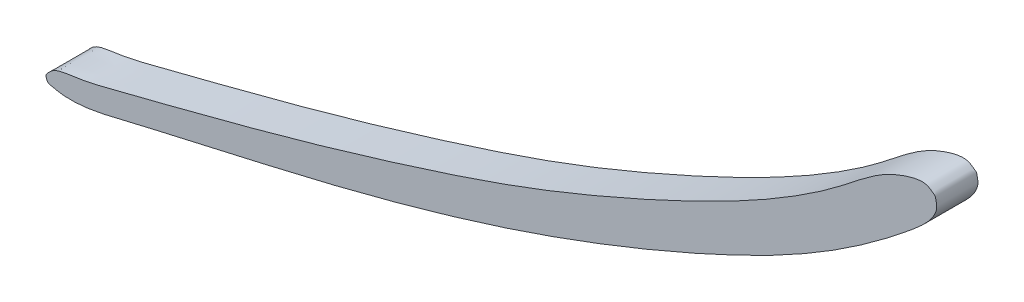
ISO-10303-21;
HEADER;
FILE_DESCRIPTION(('STEP AP214'),'2;1');
FILE_NAME('part.step','',(''),(''),'','','');
FILE_SCHEMA(('AUTOMOTIVE_DESIGN { 1 0 10303 214 1 1 1 1 }'));
ENDSEC;
DATA;
#1=APPLICATION_CONTEXT('core data for automotive mechanical design processes');
#2=APPLICATION_PROTOCOL_DEFINITION('international standard','automotive_design',2000,#1);
#3=PRODUCT_CONTEXT('',#1,'mechanical');
#4=PRODUCT('Part','Part','',(#3));
#5=PRODUCT_RELATED_PRODUCT_CATEGORY('part','',(#4));
#6=PRODUCT_DEFINITION_FORMATION('','',#4);
#7=PRODUCT_DEFINITION_CONTEXT('part definition',#1,'design');
#8=PRODUCT_DEFINITION('design','',#6,#7);
#9=PRODUCT_DEFINITION_SHAPE('','',#8);
#10=(LENGTH_UNIT() NAMED_UNIT(*) SI_UNIT(.MILLI.,.METRE.));
#11=(NAMED_UNIT(*) PLANE_ANGLE_UNIT() SI_UNIT($,.RADIAN.));
#12=(NAMED_UNIT(*) SI_UNIT($,.STERADIAN.) SOLID_ANGLE_UNIT());
#13=UNCERTAINTY_MEASURE_WITH_UNIT(LENGTH_MEASURE(1.E-05),#10,'distance_accuracy_value','');
#14=(GEOMETRIC_REPRESENTATION_CONTEXT(3) GLOBAL_UNCERTAINTY_ASSIGNED_CONTEXT((#13)) GLOBAL_UNIT_ASSIGNED_CONTEXT((#10,
#11,#12)) REPRESENTATION_CONTEXT('',''));
#15=CARTESIAN_POINT('',(0.,0.,0.));
#16=DIRECTION('',(0.,0.,1.));
#17=DIRECTION('',(1.,0.,0.));
#18=AXIS2_PLACEMENT_3D('',#15,#16,#17);
#19=CARTESIAN_POINT('',(96.7903541302584,0.,220.));
#20=CARTESIAN_POINT('',(96.7305949884533,0.112892948542311,220.));
#21=CARTESIAN_POINT('',(96.6335739233476,0.195894624406671,220.));
#22=CARTESIAN_POINT('',(96.4342964633792,0.350080639797622,220.));
#23=CARTESIAN_POINT('',(96.3300652888934,0.420822365926357,220.));
#24=CARTESIAN_POINT('',(96.1250730963667,0.567104992273969,220.));
#25=CARTESIAN_POINT('',(96.0237147495585,0.641819795805425,220.));
#26=CARTESIAN_POINT('',(95.8152024217018,0.783234128017668,220.));
#27=CARTESIAN_POINT('',(95.7084806584695,0.850125334737159,220.));
#28=CARTESIAN_POINT('',(95.4902173944732,0.972091570993068,220.));
#29=CARTESIAN_POINT('',(95.3782640803127,1.0269045485909,220.));
#30=CARTESIAN_POINT('',(95.1443501819487,1.11464771935873,220.));
#31=CARTESIAN_POINT('',(95.0216533627998,1.14855780403344,220.));
#32=CARTESIAN_POINT('',(94.6496729130398,1.22210791907423,220.));
#33=CARTESIAN_POINT('',(94.399857601767,1.23442321865137,220.));
#34=CARTESIAN_POINT('',(93.8984500700987,1.22336867425964,220.));
#35=CARTESIAN_POINT('',(93.6464849682332,1.19877095873407,220.));
#36=CARTESIAN_POINT('',(93.150528305117,1.13178790698281,220.));
#37=CARTESIAN_POINT('',(92.9050921176389,1.08835780062041,220.));
#38=CARTESIAN_POINT('',(92.1754579965681,0.931973573945645,220.));
#39=CARTESIAN_POINT('',(91.6972767066622,0.795497223712419,220.));
#40=CARTESIAN_POINT('',(90.7486323088257,0.492370083732729,220.));
#41=CARTESIAN_POINT('',(90.2774444039887,0.322798805678414,220.));
#42=CARTESIAN_POINT('',(89.3499836492739,-0.0445400427746258,220.));
#43=CARTESIAN_POINT('',(88.8941405452652,-0.241484182649347,220.));
#44=CARTESIAN_POINT('',(87.549021489601,-0.870034298573729,220.));
#45=CARTESIAN_POINT('',(86.6829413170053,-1.34068004890797,220.));
#46=CARTESIAN_POINT('',(84.1716747423128,-2.89899923855201,220.));
#47=CARTESIAN_POINT('',(82.6048693072889,-4.11865354855934,220.));
#48=CARTESIAN_POINT('',(80.2646734764845,-5.96473663269701,220.));
#49=CARTESIAN_POINT('',(79.4850022871872,-6.58075619639476,220.));
#50=CARTESIAN_POINT('',(77.9137187696427,-7.79284121974327,220.));
#51=CARTESIAN_POINT('',(77.1228172796095,-8.39009451748421,220.));
#52=CARTESIAN_POINT('',(74.7234336569646,-10.1372725171358,220.));
#53=CARTESIAN_POINT('',(73.0903647129714,-11.2461117083136,220.));
#54=CARTESIAN_POINT('',(69.7809185094782,-13.3914202239965,220.));
#55=CARTESIAN_POINT('',(68.1044480083285,-14.4277337381064,220.));
#56=CARTESIAN_POINT('',(64.7187535655036,-16.4456285031068,220.));
#57=CARTESIAN_POINT('',(63.008405337399,-17.4253310279825,220.));
#58=CARTESIAN_POINT('',(59.5542014872504,-19.3287439292616,220.));
#59=CARTESIAN_POINT('',(57.8108861270878,-20.2533571041198,220.));
#60=CARTESIAN_POINT('',(52.5429094648941,-22.9636460588946,220.));
#61=CARTESIAN_POINT('',(48.9816559518119,-24.6901926765844,220.));
#62=CARTESIAN_POINT('',(41.8031741600348,-28.0410891399149,220.));
#63=CARTESIAN_POINT('',(38.1881770543571,-29.6612466164308,220.));
#64=CARTESIAN_POINT('',(30.9181415244316,-32.8064212986165,220.));
#65=CARTESIAN_POINT('',(27.2634897396968,-34.3309954763683,220.));
#66=CARTESIAN_POINT('',(19.9024819408071,-37.2537059632437,220.));
#67=CARTESIAN_POINT('',(16.1937571420586,-38.648999835284,220.));
#68=CARTESIAN_POINT('',(8.73150760883873,-41.3039109052116,220.));
#69=CARTESIAN_POINT('',(4.97816963971906,-42.5666647281074,220.));
#70=CARTESIAN_POINT('',(-2.5546259965968,-45.0160919805606,220.));
#71=CARTESIAN_POINT('',(-6.3333386336357,-46.2043659814755,220.));
#72=CARTESIAN_POINT('',(-13.9046962589596,-48.5322985820212,220.));
#73=CARTESIAN_POINT('',(-17.6981719657624,-49.6707018459024,220.));
#74=CARTESIAN_POINT('',(-25.3048701051932,-51.8827664056766,220.));
#75=CARTESIAN_POINT('',(-29.1174700548393,-52.9555365350626,220.));
#76=CARTESIAN_POINT('',(-36.758445064676,-55.043556200328,220.));
#77=CARTESIAN_POINT('',(-40.5865711858079,-56.0600855898645,220.));
#78=CARTESIAN_POINT('',(-46.3342479649622,-57.5640837358165,220.));
#79=CARTESIAN_POINT('',(-48.2510126490625,-58.0620849078963,220.));
#80=CARTESIAN_POINT('',(-52.0848801966604,-59.0567677425516,220.));
#81=CARTESIAN_POINT('',(-54.0020173642478,-59.5533269186393,220.));
#82=CARTESIAN_POINT('',(-57.8379008672039,-60.5402059793854,220.));
#83=CARTESIAN_POINT('',(-59.7567577037724,-61.0300748613523,220.));
#84=CARTESIAN_POINT('',(-62.6371137652574,-61.7567262273177,220.));
#85=CARTESIAN_POINT('',(-63.5970484085753,-61.9997114942511,220.));
#86=CARTESIAN_POINT('',(-65.5200070075577,-62.4729441897893,220.));
#87=CARTESIAN_POINT('',(-66.4843720178816,-62.7000638020155,220.));
#88=CARTESIAN_POINT('',(-67.9394749107361,-62.9966618474036,220.));
#89=CARTESIAN_POINT('',(-68.4256917773565,-63.088536108139,220.));
#90=CARTESIAN_POINT('',(-69.4008283612045,-63.2563044478428,220.));
#91=CARTESIAN_POINT('',(-69.8899382295729,-63.331074287911,220.));
#92=CARTESIAN_POINT('',(-70.870387077495,-63.4674346965675,220.));
#93=CARTESIAN_POINT('',(-71.3612946440048,-63.5315759273488,220.));
#94=CARTESIAN_POINT('',(-72.3364940900285,-63.6989726042637,220.));
#95=CARTESIAN_POINT('',(-72.8204771391909,-63.7975324690808,220.));
#96=CARTESIAN_POINT('',(-73.524657755428,-64.0210159462771,220.));
#97=CARTESIAN_POINT('',(-73.756856305871,-64.1095910513737,220.));
#98=CARTESIAN_POINT('',(-74.2026790727655,-64.3301311074189,220.));
#99=CARTESIAN_POINT('',(-74.4102475303053,-64.4613304882591,220.));
#100=CARTESIAN_POINT('',(-74.793834838514,-64.7667662076517,220.));
#101=CARTESIAN_POINT('',(-74.9723633734347,-64.9383522650277,220.));
#102=CARTESIAN_POINT('',(-75.228861185538,-65.2083131575347,220.));
#103=CARTESIAN_POINT('',(-75.3148088801341,-65.2979481984473,220.));
#104=CARTESIAN_POINT('',(-75.4773568073048,-65.4856873593421,220.));
#105=CARTESIAN_POINT('',(-75.5571770517585,-65.5834510911468,220.));
#106=CARTESIAN_POINT('',(-75.6327297567494,-65.7530257810289,220.));
#107=CARTESIAN_POINT('',(-75.6489242330333,-65.8136575434468,220.));
#108=CARTESIAN_POINT('',(-75.6594345041673,-65.9377139949759,220.));
#109=CARTESIAN_POINT('',(-75.6551170847018,-65.9999289573187,220.));
#110=CARTESIAN_POINT('',(-75.6248033414668,-66.1843917090516,220.));
#111=CARTESIAN_POINT('',(-75.5853056549913,-66.3006968357179,220.));
#112=CARTESIAN_POINT('',(-75.4978570255118,-66.5303839225085,220.));
#113=CARTESIAN_POINT('',(-75.4484985632104,-66.6454627273325,220.));
#114=CARTESIAN_POINT('',(-75.3122851638385,-66.8506124549856,220.));
#115=CARTESIAN_POINT('',(-75.2182898005647,-66.937299452302,220.));
#116=CARTESIAN_POINT('',(-74.9892065398328,-67.0382352412229,220.));
#117=CARTESIAN_POINT('',(-74.8679186134792,-67.0580516351862,220.));
#118=CARTESIAN_POINT('',(-74.6256857560864,-67.0992428073079,220.));
#119=CARTESIAN_POINT('',(-74.5045832032763,-67.119707958869,220.));
#120=CARTESIAN_POINT('',(-74.1435397802375,-67.1928716857581,220.));
#121=CARTESIAN_POINT('',(-73.9042599518307,-67.2500280416313,220.));
#122=CARTESIAN_POINT('',(-73.4249597391757,-67.3599571444452,220.));
#123=CARTESIAN_POINT('',(-73.1845618191114,-67.4104951248989,220.));
#124=CARTESIAN_POINT('',(-72.6996470050672,-67.4871894391582,220.));
#125=CARTESIAN_POINT('',(-72.4553966527645,-67.5149235263368,220.));
#126=CARTESIAN_POINT('',(-71.7189419341738,-67.5762025195282,220.));
#127=CARTESIAN_POINT('',(-71.2260595682472,-67.5867231274564,220.));
#128=CARTESIAN_POINT('',(-69.7585556254548,-67.5751431212569,220.));
#129=CARTESIAN_POINT('',(-68.7874308838809,-67.5000098879079,220.));
#130=CARTESIAN_POINT('',(-66.8559749186895,-67.2488415112647,220.));
#131=CARTESIAN_POINT('',(-65.8953658687617,-67.0754035939593,220.));
#132=CARTESIAN_POINT('',(-63.9783291152675,-66.6894389436625,220.));
#133=CARTESIAN_POINT('',(-63.0225823353128,-66.4752589474299,220.));
#134=CARTESIAN_POINT('',(-60.1625364311694,-65.8107978727767,220.));
#135=CARTESIAN_POINT('',(-58.2618532347147,-65.3426877918025,220.));
#136=CARTESIAN_POINT('',(-54.455211683153,-64.4285153424552,220.));
#137=CARTESIAN_POINT('',(-52.5502337877498,-63.9784073930136,220.));
#138=CARTESIAN_POINT('',(-46.8293007505648,-62.6545486048933,220.));
#139=CARTESIAN_POINT('',(-43.0088145109386,-61.8004512876852,220.));
#140=CARTESIAN_POINT('',(-35.3714887967491,-60.0764646863882,220.));
#141=CARTESIAN_POINT('',(-31.5546616607611,-59.2068945083663,220.));
#142=CARTESIAN_POINT('',(-23.9353315805755,-57.4086315305462,220.));
#143=CARTESIAN_POINT('',(-20.1325994117565,-56.4808848476954,220.));
#144=CARTESIAN_POINT('',(-12.5456665940645,-54.5489032541957,220.));
#145=CARTESIAN_POINT('',(-8.76106029659944,-53.5439550806282,220.));
#146=CARTESIAN_POINT('',(2.55362918040278,-50.394284643434,220.));
#147=CARTESIAN_POINT('',(10.0474385906183,-48.1150590047542,220.));
#148=CARTESIAN_POINT('',(21.1720979958242,-44.3473086992252,220.));
#149=CARTESIAN_POINT('',(24.8607142438852,-43.0334175010199,220.));
#150=CARTESIAN_POINT('',(32.1953990097638,-40.2940420904069,220.));
#151=CARTESIAN_POINT('',(35.8439756259027,-38.8676407059211,220.));
#152=CARTESIAN_POINT('',(43.0841750840518,-35.9155516975799,220.));
#153=CARTESIAN_POINT('',(46.6775462771992,-34.3890694904359,220.));
#154=CARTESIAN_POINT('',(53.8050998675848,-31.2244137019707,220.));
#155=CARTESIAN_POINT('',(57.338962063662,-29.5856358896102,220.));
#156=CARTESIAN_POINT('',(64.3212250533233,-26.146811542711,220.));
#157=CARTESIAN_POINT('',(67.7684559509532,-24.3445573726773,220.));
#158=CARTESIAN_POINT('',(72.8406920845307,-21.4550951201364,220.));
#159=CARTESIAN_POINT('',(74.5150799674904,-20.4610738582186,220.));
#160=CARTESIAN_POINT('',(77.8257232660616,-18.40107400507,220.));
#161=CARTESIAN_POINT('',(79.462210123133,-17.3355321521489,220.));
#162=CARTESIAN_POINT('',(82.6967106749051,-15.1318482133053,220.));
#163=CARTESIAN_POINT('',(84.2941007490677,-13.9925293331297,220.));
#164=CARTESIAN_POINT('',(87.4513529902218,-11.6430750701358,220.));
#165=CARTESIAN_POINT('',(89.0139721901871,-10.4333104865862,220.));
#166=CARTESIAN_POINT('',(91.325470708978,-8.57953806515805,220.));
#167=CARTESIAN_POINT('',(92.0909451495402,-7.95485960017399,220.));
#168=CARTESIAN_POINT('',(93.2179830225857,-6.99346896524365,220.));
#169=CARTESIAN_POINT('',(93.5892188675962,-6.66797477567153,220.));
#170=CARTESIAN_POINT('',(94.3165207412738,-5.99981189850999,220.));
#171=CARTESIAN_POINT('',(94.6738618854464,-5.65761289457572,220.));
#172=CARTESIAN_POINT('',(95.3530223635759,-4.94507472154259,220.));
#173=CARTESIAN_POINT('',(95.6752681682302,-4.57436365404873,220.));
#174=CARTESIAN_POINT('',(96.1139582547448,-3.98107358352141,220.));
#175=CARTESIAN_POINT('',(96.2525465324631,-3.77694359124716,220.));
#176=CARTESIAN_POINT('',(96.5088411310167,-3.35128604892823,220.));
#177=CARTESIAN_POINT('',(96.6251784536732,-3.13119314308895,220.));
#178=CARTESIAN_POINT('',(96.8291639579267,-2.68029680729038,220.));
#179=CARTESIAN_POINT('',(96.9177818742282,-2.44802611350493,220.));
#180=CARTESIAN_POINT('',(97.045239931142,-1.96574011093586,220.));
#181=CARTESIAN_POINT('',(97.0835717706669,-1.72206521069932,220.));
#182=CARTESIAN_POINT('',(97.0728463285405,-1.34975154652044,220.));
#183=CARTESIAN_POINT('',(97.0566669597407,-1.22407026588911,220.));
#184=CARTESIAN_POINT('',(97.0122059567839,-0.977406355455295,220.));
#185=CARTESIAN_POINT('',(96.9835794249225,-0.855418677761384,220.));
#186=CARTESIAN_POINT('',(96.9290812371088,-0.610864319845258,220.));
#187=CARTESIAN_POINT('',(96.9069435629471,-0.487512854765652,220.));
#188=CARTESIAN_POINT('',(96.8761150102114,-0.301985872751682,220.));
#189=CARTESIAN_POINT('',(96.8663878598926,-0.24002815290876,220.));
#190=CARTESIAN_POINT('',(96.8388867259694,-0.117803946139459,220.));
#191=CARTESIAN_POINT('',(96.8202337011609,-0.0564464742711363,220.));
#192=CARTESIAN_POINT('',(96.7903541302584,0.,220.));
#193=B_SPLINE_CURVE_WITH_KNOTS('',3,(#19,#20,#21,#22,#23,#24,#25,#26,#27,#28,#29,#30,#31,#32,
#33,#34,#35,#36,#37,#38,#39,#40,#41,#42,#43,#44,#45,#46,#47,#48,#49,#50,#51,#52,#53,#54,#55,#56,
#57,#58,#59,#60,#61,#62,#63,#64,#65,#66,#67,#68,#69,#70,#71,#72,#73,#74,#75,#76,#77,#78,#79,#80,
#81,#82,#83,#84,#85,#86,#87,#88,#89,#90,#91,#92,#93,#94,#95,#96,#97,#98,#99,#100,#101,#102,#103,
#104,#105,#106,#107,#108,#109,#110,#111,#112,#113,#114,#115,#116,#117,#118,#119,#120,#121,#122,
#123,#124,#125,#126,#127,#128,#129,#130,#131,#132,#133,#134,#135,#136,#137,#138,#139,#140,#141,
#142,#143,#144,#145,#146,#147,#148,#149,#150,#151,#152,#153,#154,#155,#156,#157,#158,#159,#160,
#161,#162,#163,#164,#165,#166,#167,#168,#169,#170,#171,#172,#173,#174,#175,#176,#177,#178,#179,
#180,#181,#182,#183,#184,#185,#186,#187,#188,#189,#190,#191,#192),.UNSPECIFIED.,.T.,.F.,(4,2,2,
2,2,2,2,2,2,2,2,2,2,2,2,2,2,2,2,2,2,2,2,2,2,2,2,2,2,2,2,2,2,2,2,2,2,2,2,2,2,2,2,2,2,2,2,2,2,2,2,
2,2,2,2,2,2,2,2,2,2,2,2,2,2,2,2,2,2,2,2,2,2,2,2,2,2,2,2,2,2,2,2,2,2,2,4),(0.,
0.000976562500000052,0.0019531250000001,0.00292968750000016,0.00390625000000021,
0.00488281250000026,0.00585937500000031,0.00781250000000042,0.00976562500000052,
0.0117187500000006,0.0156250000000009,0.0195312500000013,0.0234375000000016,0.0312500000000023,
0.0468750000000037,0.0546875000000045,0.0625000000000052,0.0781250000000066,0.0937500000000081,
0.10937500000001,0.125000000000011,0.156250000000014,0.187500000000017,0.218750000000019,
0.250000000000022,0.281250000000025,0.312500000000028,0.34375000000003,0.375000000000033,
0.406250000000036,0.421875000000037,0.437500000000039,0.45312500000004,0.460937500000041,
0.468750000000042,0.472656250000042,0.476562500000042,0.480468750000043,0.484375000000043,
0.486328125000043,0.488281250000043,0.490234375000044,0.491210937500044,0.492187500000044,
0.492675781250044,0.493164062500044,0.494140625000044,0.495117187500044,0.496093750000044,
0.497070312500044,0.498046875000044,0.500000000000044,0.501953125000044,0.503906250000044,
0.507812500000043,0.515625000000043,0.523437500000042,0.531250000000041,0.54687500000004,
0.562500000000038,0.593750000000036,0.625000000000033,0.65625000000003,0.687500000000027,
0.750000000000022,0.781250000000019,0.812500000000017,0.843750000000014,0.875000000000011,
0.906250000000009,0.921875000000007,0.937500000000006,0.953125000000004,0.968750000000003,
0.976562500000002,0.980468750000002,0.984375000000002,0.988281250000001,0.990234375000001,
0.992187500000001,0.994140625000001,0.99609375,0.9970703125,0.998046875,0.9990234375,
0.99951171875,1.),.UNSPECIFIED.);
#194=DIRECTION('',(0.,0.,-1.));
#195=VECTOR('',#194,1.);
#196=SURFACE_OF_LINEAR_EXTRUSION('',#193,#195);
#197=CARTESIAN_POINT('',(96.7903541302584,0.,220.));
#198=CARTESIAN_POINT('',(96.8202337011609,-0.0564464742711363,220.));
#199=CARTESIAN_POINT('',(96.8388867259694,-0.117803946139459,220.));
#200=CARTESIAN_POINT('',(96.8663878598926,-0.24002815290876,220.));
#201=CARTESIAN_POINT('',(96.8761150102114,-0.301985872751682,220.));
#202=CARTESIAN_POINT('',(96.9069435629471,-0.487512854765652,220.));
#203=CARTESIAN_POINT('',(96.9290812371088,-0.610864319845258,220.));
#204=CARTESIAN_POINT('',(96.9835794249225,-0.855418677761384,220.));
#205=CARTESIAN_POINT('',(97.0122059567839,-0.977406355455295,220.));
#206=CARTESIAN_POINT('',(97.0566669597407,-1.22407026588911,220.));
#207=CARTESIAN_POINT('',(97.0728463285405,-1.34975154652044,220.));
#208=CARTESIAN_POINT('',(97.0835717706669,-1.72206521069932,220.));
#209=CARTESIAN_POINT('',(97.045239931142,-1.96574011093586,220.));
#210=CARTESIAN_POINT('',(96.9177818742282,-2.44802611350493,220.));
#211=CARTESIAN_POINT('',(96.8291639579267,-2.68029680729038,220.));
#212=CARTESIAN_POINT('',(96.6251784536732,-3.13119314308895,220.));
#213=CARTESIAN_POINT('',(96.5088411310167,-3.35128604892823,220.));
#214=CARTESIAN_POINT('',(96.2525465324631,-3.77694359124716,220.));
#215=CARTESIAN_POINT('',(96.1139582547448,-3.98107358352141,220.));
#216=CARTESIAN_POINT('',(95.6752681682302,-4.57436365404873,220.));
#217=CARTESIAN_POINT('',(95.3530223635759,-4.94507472154259,220.));
#218=CARTESIAN_POINT('',(94.6738618854464,-5.65761289457572,220.));
#219=CARTESIAN_POINT('',(94.3165207412738,-5.99981189850999,220.));
#220=CARTESIAN_POINT('',(93.5892188675962,-6.66797477567153,220.));
#221=CARTESIAN_POINT('',(93.2179830225857,-6.99346896524365,220.));
#222=CARTESIAN_POINT('',(92.0909451495402,-7.95485960017399,220.));
#223=CARTESIAN_POINT('',(91.325470708978,-8.57953806515805,220.));
#224=CARTESIAN_POINT('',(89.0139721901871,-10.4333104865862,220.));
#225=CARTESIAN_POINT('',(87.4513529902218,-11.6430750701358,220.));
#226=CARTESIAN_POINT('',(84.2941007490677,-13.9925293331297,220.));
#227=CARTESIAN_POINT('',(82.6967106749051,-15.1318482133053,220.));
#228=CARTESIAN_POINT('',(79.462210123133,-17.3355321521489,220.));
#229=CARTESIAN_POINT('',(77.8257232660616,-18.40107400507,220.));
#230=CARTESIAN_POINT('',(74.5150799674904,-20.4610738582186,220.));
#231=CARTESIAN_POINT('',(72.8406920845307,-21.4550951201364,220.));
#232=CARTESIAN_POINT('',(67.7684559509532,-24.3445573726773,220.));
#233=CARTESIAN_POINT('',(64.3212250533233,-26.146811542711,220.));
#234=CARTESIAN_POINT('',(57.338962063662,-29.5856358896102,220.));
#235=CARTESIAN_POINT('',(53.8050998675848,-31.2244137019707,220.));
#236=CARTESIAN_POINT('',(46.6775462771992,-34.3890694904359,220.));
#237=CARTESIAN_POINT('',(43.0841750840518,-35.9155516975799,220.));
#238=CARTESIAN_POINT('',(35.8439756259027,-38.8676407059211,220.));
#239=CARTESIAN_POINT('',(32.1953990097638,-40.2940420904069,220.));
#240=CARTESIAN_POINT('',(24.8607142438852,-43.0334175010199,220.));
#241=CARTESIAN_POINT('',(21.1720979958242,-44.3473086992252,220.));
#242=CARTESIAN_POINT('',(10.0474385906183,-48.1150590047542,220.));
#243=CARTESIAN_POINT('',(2.55362918040278,-50.394284643434,220.));
#244=CARTESIAN_POINT('',(-8.76106029659944,-53.5439550806282,220.));
#245=CARTESIAN_POINT('',(-12.5456665940645,-54.5489032541957,220.));
#246=CARTESIAN_POINT('',(-20.1325994117565,-56.4808848476954,220.));
#247=CARTESIAN_POINT('',(-23.9353315805755,-57.4086315305462,220.));
#248=CARTESIAN_POINT('',(-31.5546616607611,-59.2068945083663,220.));
#249=CARTESIAN_POINT('',(-35.3714887967491,-60.0764646863882,220.));
#250=CARTESIAN_POINT('',(-43.0088145109386,-61.8004512876852,220.));
#251=CARTESIAN_POINT('',(-46.8293007505648,-62.6545486048933,220.));
#252=CARTESIAN_POINT('',(-52.5502337877498,-63.9784073930136,220.));
#253=CARTESIAN_POINT('',(-54.455211683153,-64.4285153424552,220.));
#254=CARTESIAN_POINT('',(-58.2618532347147,-65.3426877918025,220.));
#255=CARTESIAN_POINT('',(-60.1625364311694,-65.8107978727767,220.));
#256=CARTESIAN_POINT('',(-63.0225823353128,-66.4752589474299,220.));
#257=CARTESIAN_POINT('',(-63.9783291152675,-66.6894389436625,220.));
#258=CARTESIAN_POINT('',(-65.8953658687617,-67.0754035939593,220.));
#259=CARTESIAN_POINT('',(-66.8559749186895,-67.2488415112647,220.));
#260=CARTESIAN_POINT('',(-68.7874308838809,-67.5000098879079,220.));
#261=CARTESIAN_POINT('',(-69.7585556254548,-67.5751431212569,220.));
#262=CARTESIAN_POINT('',(-71.2260595682472,-67.5867231274564,220.));
#263=CARTESIAN_POINT('',(-71.7189419341738,-67.5762025195282,220.));
#264=CARTESIAN_POINT('',(-72.4553966527645,-67.5149235263368,220.));
#265=CARTESIAN_POINT('',(-72.6996470050672,-67.4871894391582,220.));
#266=CARTESIAN_POINT('',(-73.1845618191114,-67.4104951248989,220.));
#267=CARTESIAN_POINT('',(-73.4249597391757,-67.3599571444452,220.));
#268=CARTESIAN_POINT('',(-73.9042599518307,-67.2500280416313,220.));
#269=CARTESIAN_POINT('',(-74.1435397802375,-67.1928716857581,220.));
#270=CARTESIAN_POINT('',(-74.5045832032763,-67.119707958869,220.));
#271=CARTESIAN_POINT('',(-74.6256857560864,-67.0992428073079,220.));
#272=CARTESIAN_POINT('',(-74.8679186134792,-67.0580516351862,220.));
#273=CARTESIAN_POINT('',(-74.9892065398328,-67.0382352412229,220.));
#274=CARTESIAN_POINT('',(-75.2182898005647,-66.937299452302,220.));
#275=CARTESIAN_POINT('',(-75.3122851638385,-66.8506124549856,220.));
#276=CARTESIAN_POINT('',(-75.4484985632104,-66.6454627273325,220.));
#277=CARTESIAN_POINT('',(-75.4978570255118,-66.5303839225085,220.));
#278=CARTESIAN_POINT('',(-75.5853056549913,-66.3006968357179,220.));
#279=CARTESIAN_POINT('',(-75.6248033414668,-66.1843917090516,220.));
#280=CARTESIAN_POINT('',(-75.6551170847018,-65.9999289573187,220.));
#281=CARTESIAN_POINT('',(-75.6594345041673,-65.9377139949759,220.));
#282=CARTESIAN_POINT('',(-75.6489242330333,-65.8136575434468,220.));
#283=CARTESIAN_POINT('',(-75.6327297567494,-65.7530257810289,220.));
#284=CARTESIAN_POINT('',(-75.5571770517585,-65.5834510911468,220.));
#285=CARTESIAN_POINT('',(-75.4773568073048,-65.4856873593421,220.));
#286=CARTESIAN_POINT('',(-75.3148088801341,-65.2979481984473,220.));
#287=CARTESIAN_POINT('',(-75.228861185538,-65.2083131575347,220.));
#288=CARTESIAN_POINT('',(-74.9723633734347,-64.9383522650277,220.));
#289=CARTESIAN_POINT('',(-74.793834838514,-64.7667662076517,220.));
#290=CARTESIAN_POINT('',(-74.4102475303053,-64.4613304882591,220.));
#291=CARTESIAN_POINT('',(-74.2026790727655,-64.3301311074189,220.));
#292=CARTESIAN_POINT('',(-73.756856305871,-64.1095910513737,220.));
#293=CARTESIAN_POINT('',(-73.524657755428,-64.0210159462771,220.));
#294=CARTESIAN_POINT('',(-72.8204771391909,-63.7975324690808,220.));
#295=CARTESIAN_POINT('',(-72.3364940900285,-63.6989726042637,220.));
#296=CARTESIAN_POINT('',(-71.3612946440048,-63.5315759273488,220.));
#297=CARTESIAN_POINT('',(-70.870387077495,-63.4674346965675,220.));
#298=CARTESIAN_POINT('',(-69.8899382295729,-63.331074287911,220.));
#299=CARTESIAN_POINT('',(-69.4008283612045,-63.2563044478428,220.));
#300=CARTESIAN_POINT('',(-68.4256917773565,-63.088536108139,220.));
#301=CARTESIAN_POINT('',(-67.9394749107361,-62.9966618474036,220.));
#302=CARTESIAN_POINT('',(-66.4843720178816,-62.7000638020155,220.));
#303=CARTESIAN_POINT('',(-65.5200070075577,-62.4729441897893,220.));
#304=CARTESIAN_POINT('',(-63.5970484085753,-61.9997114942511,220.));
#305=CARTESIAN_POINT('',(-62.6371137652574,-61.7567262273177,220.));
#306=CARTESIAN_POINT('',(-59.7567577037724,-61.0300748613523,220.));
#307=CARTESIAN_POINT('',(-57.8379008672039,-60.5402059793854,220.));
#308=CARTESIAN_POINT('',(-54.0020173642478,-59.5533269186393,220.));
#309=CARTESIAN_POINT('',(-52.0848801966604,-59.0567677425516,220.));
#310=CARTESIAN_POINT('',(-48.2510126490625,-58.0620849078963,220.));
#311=CARTESIAN_POINT('',(-46.3342479649622,-57.5640837358165,220.));
#312=CARTESIAN_POINT('',(-40.5865711858079,-56.0600855898645,220.));
#313=CARTESIAN_POINT('',(-36.758445064676,-55.043556200328,220.));
#314=CARTESIAN_POINT('',(-29.1174700548393,-52.9555365350626,220.));
#315=CARTESIAN_POINT('',(-25.3048701051932,-51.8827664056766,220.));
#316=CARTESIAN_POINT('',(-17.6981719657624,-49.6707018459024,220.));
#317=CARTESIAN_POINT('',(-13.9046962589596,-48.5322985820212,220.));
#318=CARTESIAN_POINT('',(-6.3333386336357,-46.2043659814755,220.));
#319=CARTESIAN_POINT('',(-2.5546259965968,-45.0160919805606,220.));
#320=CARTESIAN_POINT('',(4.97816963971906,-42.5666647281074,220.));
#321=CARTESIAN_POINT('',(8.73150760883873,-41.3039109052116,220.));
#322=CARTESIAN_POINT('',(16.1937571420586,-38.648999835284,220.));
#323=CARTESIAN_POINT('',(19.9024819408071,-37.2537059632437,220.));
#324=CARTESIAN_POINT('',(27.2634897396968,-34.3309954763683,220.));
#325=CARTESIAN_POINT('',(30.9181415244316,-32.8064212986165,220.));
#326=CARTESIAN_POINT('',(38.1881770543571,-29.6612466164308,220.));
#327=CARTESIAN_POINT('',(41.8031741600348,-28.0410891399149,220.));
#328=CARTESIAN_POINT('',(48.9816559518119,-24.6901926765844,220.));
#329=CARTESIAN_POINT('',(52.5429094648941,-22.9636460588946,220.));
#330=CARTESIAN_POINT('',(57.8108861270878,-20.2533571041198,220.));
#331=CARTESIAN_POINT('',(59.5542014872504,-19.3287439292616,220.));
#332=CARTESIAN_POINT('',(63.008405337399,-17.4253310279825,220.));
#333=CARTESIAN_POINT('',(64.7187535655036,-16.4456285031068,220.));
#334=CARTESIAN_POINT('',(68.1044480083285,-14.4277337381064,220.));
#335=CARTESIAN_POINT('',(69.7809185094782,-13.3914202239965,220.));
#336=CARTESIAN_POINT('',(73.0903647129714,-11.2461117083136,220.));
#337=CARTESIAN_POINT('',(74.7234336569646,-10.1372725171358,220.));
#338=CARTESIAN_POINT('',(77.1228172796095,-8.39009451748421,220.));
#339=CARTESIAN_POINT('',(77.9137187696427,-7.79284121974327,220.));
#340=CARTESIAN_POINT('',(79.4850022871872,-6.58075619639476,220.));
#341=CARTESIAN_POINT('',(80.2646734764845,-5.96473663269701,220.));
#342=CARTESIAN_POINT('',(82.6048693072889,-4.11865354855934,220.));
#343=CARTESIAN_POINT('',(84.1716747423128,-2.89899923855201,220.));
#344=CARTESIAN_POINT('',(86.6829413170053,-1.34068004890797,220.));
#345=CARTESIAN_POINT('',(87.549021489601,-0.870034298573729,220.));
#346=CARTESIAN_POINT('',(88.8941405452652,-0.241484182649347,220.));
#347=CARTESIAN_POINT('',(89.3499836492739,-0.0445400427746258,220.));
#348=CARTESIAN_POINT('',(90.2774444039887,0.322798805678414,220.));
#349=CARTESIAN_POINT('',(90.7486323088257,0.492370083732729,220.));
#350=CARTESIAN_POINT('',(91.6972767066622,0.795497223712419,220.));
#351=CARTESIAN_POINT('',(92.1754579965681,0.931973573945645,220.));
#352=CARTESIAN_POINT('',(92.9050921176389,1.08835780062041,220.));
#353=CARTESIAN_POINT('',(93.150528305117,1.13178790698281,220.));
#354=CARTESIAN_POINT('',(93.6464849682332,1.19877095873407,220.));
#355=CARTESIAN_POINT('',(93.8984500700987,1.22336867425964,220.));
#356=CARTESIAN_POINT('',(94.399857601767,1.23442321865137,220.));
#357=CARTESIAN_POINT('',(94.6496729130398,1.22210791907423,220.));
#358=CARTESIAN_POINT('',(95.0216533627998,1.14855780403344,220.));
#359=CARTESIAN_POINT('',(95.1443501819487,1.11464771935873,220.));
#360=CARTESIAN_POINT('',(95.3782640803127,1.0269045485909,220.));
#361=CARTESIAN_POINT('',(95.4902173944732,0.972091570993068,220.));
#362=CARTESIAN_POINT('',(95.7084806584695,0.850125334737159,220.));
#363=CARTESIAN_POINT('',(95.8152024217018,0.783234128017668,220.));
#364=CARTESIAN_POINT('',(96.0237147495585,0.641819795805425,220.));
#365=CARTESIAN_POINT('',(96.1250730963667,0.567104992273969,220.));
#366=CARTESIAN_POINT('',(96.3300652888934,0.420822365926357,220.));
#367=CARTESIAN_POINT('',(96.4342964633792,0.350080639797622,220.));
#368=CARTESIAN_POINT('',(96.6335739233476,0.195894624406671,220.));
#369=CARTESIAN_POINT('',(96.7305949884533,0.112892948542311,220.));
#370=CARTESIAN_POINT('',(96.7903541302584,0.,220.));
#371=B_SPLINE_CURVE_WITH_KNOTS('',3,(#197,#198,#199,#200,#201,#202,#203,#204,#205,#206,#207,
#208,#209,#210,#211,#212,#213,#214,#215,#216,#217,#218,#219,#220,#221,#222,#223,#224,#225,#226,
#227,#228,#229,#230,#231,#232,#233,#234,#235,#236,#237,#238,#239,#240,#241,#242,#243,#244,#245,
#246,#247,#248,#249,#250,#251,#252,#253,#254,#255,#256,#257,#258,#259,#260,#261,#262,#263,#264,
#265,#266,#267,#268,#269,#270,#271,#272,#273,#274,#275,#276,#277,#278,#279,#280,#281,#282,#283,
#284,#285,#286,#287,#288,#289,#290,#291,#292,#293,#294,#295,#296,#297,#298,#299,#300,#301,#302,
#303,#304,#305,#306,#307,#308,#309,#310,#311,#312,#313,#314,#315,#316,#317,#318,#319,#320,#321,
#322,#323,#324,#325,#326,#327,#328,#329,#330,#331,#332,#333,#334,#335,#336,#337,#338,#339,#340,
#341,#342,#343,#344,#345,#346,#347,#348,#349,#350,#351,#352,#353,#354,#355,#356,#357,#358,#359,
#360,#361,#362,#363,#364,#365,#366,#367,#368,#369,#370),.UNSPECIFIED.,.T.,.F.,(4,2,2,2,2,2,2,2,
2,2,2,2,2,2,2,2,2,2,2,2,2,2,2,2,2,2,2,2,2,2,2,2,2,2,2,2,2,2,2,2,2,2,2,2,2,2,2,2,2,2,2,2,2,2,2,2,
2,2,2,2,2,2,2,2,2,2,2,2,2,2,2,2,2,2,2,2,2,2,2,2,2,2,2,2,2,2,4),(0.,0.000488281249999778,
0.000976562499999667,0.00195312499999967,0.00292968749999956,0.00390624999999956,
0.00585937499999933,0.00781249999999911,0.00976562499999889,0.0117187499999987,
0.0156249999999983,0.0195312499999979,0.0234374999999976,0.0312499999999969,0.0468749999999956,
0.0624999999999941,0.0781249999999928,0.0937499999999913,0.124999999999989,0.156249999999986,
0.187499999999983,0.218749999999981,0.249999999999978,0.312499999999973,0.34374999999997,
0.374999999999967,0.406249999999964,0.437499999999962,0.45312499999996,0.468749999999959,
0.476562499999958,0.484374999999957,0.492187499999957,0.496093749999956,0.498046874999956,
0.499999999999956,0.501953124999956,0.502929687499956,0.503906249999956,0.504882812499956,
0.505859374999956,0.506835937499956,0.507324218749956,0.507812499999956,0.508789062499956,
0.509765624999956,0.511718749999957,0.513671874999957,0.515624999999957,0.519531249999957,
0.523437499999958,0.527343749999958,0.531249999999958,0.539062499999959,0.54687499999996,
0.562499999999961,0.578124999999963,0.593749999999964,0.624999999999967,0.65624999999997,
0.687499999999972,0.718749999999975,0.749999999999978,0.781249999999981,0.812499999999983,
0.843749999999986,0.874999999999989,0.89062499999999,0.906249999999992,0.921874999999993,
0.937499999999995,0.945312499999996,0.953124999999996,0.968749999999998,0.976562499999998,
0.980468749999999,0.984374999999999,0.988281249999999,0.990234374999999,0.9921875,0.994140625,
0.9951171875,0.99609375,0.9970703125,0.998046875,0.9990234375,1.),.UNSPECIFIED.);
#372=CARTESIAN_POINT('',(96.7903541302584,0.,220.));
#373=VERTEX_POINT('',#372);
#374=EDGE_CURVE('E10',#373,#373,#371,.F.);
#375=ORIENTED_EDGE('',*,*,#374,.F.);
#376=EDGE_LOOP('',(#375));
#377=FACE_BOUND('',#376,.T.);
#378=CARTESIAN_POINT('',(96.7903541302584,0.,212.));
#379=CARTESIAN_POINT('',(96.7305949884533,0.112892948542311,212.));
#380=CARTESIAN_POINT('',(96.6335739233476,0.195894624406671,212.));
#381=CARTESIAN_POINT('',(96.4342964633792,0.350080639797622,212.));
#382=CARTESIAN_POINT('',(96.3300652888934,0.420822365926357,212.));
#383=CARTESIAN_POINT('',(96.1250730963667,0.567104992273969,212.));
#384=CARTESIAN_POINT('',(96.0237147495585,0.641819795805425,212.));
#385=CARTESIAN_POINT('',(95.8152024217018,0.783234128017668,212.));
#386=CARTESIAN_POINT('',(95.7084806584695,0.850125334737159,212.));
#387=CARTESIAN_POINT('',(95.4902173944732,0.972091570993068,212.));
#388=CARTESIAN_POINT('',(95.3782640803127,1.0269045485909,212.));
#389=CARTESIAN_POINT('',(95.1443501819487,1.11464771935873,212.));
#390=CARTESIAN_POINT('',(95.0216533627998,1.14855780403344,212.));
#391=CARTESIAN_POINT('',(94.6496729130398,1.22210791907423,212.));
#392=CARTESIAN_POINT('',(94.399857601767,1.23442321865137,212.));
#393=CARTESIAN_POINT('',(93.8984500700987,1.22336867425964,212.));
#394=CARTESIAN_POINT('',(93.6464849682332,1.19877095873407,212.));
#395=CARTESIAN_POINT('',(93.150528305117,1.13178790698281,212.));
#396=CARTESIAN_POINT('',(92.9050921176389,1.08835780062041,212.));
#397=CARTESIAN_POINT('',(92.1754579965681,0.931973573945645,212.));
#398=CARTESIAN_POINT('',(91.6972767066622,0.795497223712419,212.));
#399=CARTESIAN_POINT('',(90.7486323088257,0.492370083732729,212.));
#400=CARTESIAN_POINT('',(90.2774444039887,0.322798805678414,212.));
#401=CARTESIAN_POINT('',(89.3499836492739,-0.0445400427746258,212.));
#402=CARTESIAN_POINT('',(88.8941405452652,-0.241484182649347,212.));
#403=CARTESIAN_POINT('',(87.549021489601,-0.870034298573729,212.));
#404=CARTESIAN_POINT('',(86.6829413170053,-1.34068004890797,212.));
#405=CARTESIAN_POINT('',(84.1716747423128,-2.89899923855201,212.));
#406=CARTESIAN_POINT('',(82.6048693072889,-4.11865354855934,212.));
#407=CARTESIAN_POINT('',(80.2646734764845,-5.96473663269701,212.));
#408=CARTESIAN_POINT('',(79.4850022871872,-6.58075619639476,212.));
#409=CARTESIAN_POINT('',(77.9137187696427,-7.79284121974327,212.));
#410=CARTESIAN_POINT('',(77.1228172796095,-8.39009451748421,212.));
#411=CARTESIAN_POINT('',(74.7234336569646,-10.1372725171358,212.));
#412=CARTESIAN_POINT('',(73.0903647129714,-11.2461117083136,212.));
#413=CARTESIAN_POINT('',(69.7809185094782,-13.3914202239965,212.));
#414=CARTESIAN_POINT('',(68.1044480083285,-14.4277337381064,212.));
#415=CARTESIAN_POINT('',(64.7187535655036,-16.4456285031068,212.));
#416=CARTESIAN_POINT('',(63.008405337399,-17.4253310279825,212.));
#417=CARTESIAN_POINT('',(59.5542014872504,-19.3287439292616,212.));
#418=CARTESIAN_POINT('',(57.8108861270878,-20.2533571041198,212.));
#419=CARTESIAN_POINT('',(52.5429094648941,-22.9636460588946,212.));
#420=CARTESIAN_POINT('',(48.9816559518119,-24.6901926765844,212.));
#421=CARTESIAN_POINT('',(41.8031741600348,-28.0410891399149,212.));
#422=CARTESIAN_POINT('',(38.1881770543571,-29.6612466164308,212.));
#423=CARTESIAN_POINT('',(30.9181415244316,-32.8064212986165,212.));
#424=CARTESIAN_POINT('',(27.2634897396968,-34.3309954763683,212.));
#425=CARTESIAN_POINT('',(19.9024819408071,-37.2537059632437,212.));
#426=CARTESIAN_POINT('',(16.1937571420586,-38.648999835284,212.));
#427=CARTESIAN_POINT('',(8.73150760883873,-41.3039109052116,212.));
#428=CARTESIAN_POINT('',(4.97816963971906,-42.5666647281074,212.));
#429=CARTESIAN_POINT('',(-2.5546259965968,-45.0160919805606,212.));
#430=CARTESIAN_POINT('',(-6.3333386336357,-46.2043659814755,212.));
#431=CARTESIAN_POINT('',(-13.9046962589596,-48.5322985820212,212.));
#432=CARTESIAN_POINT('',(-17.6981719657624,-49.6707018459024,212.));
#433=CARTESIAN_POINT('',(-25.3048701051932,-51.8827664056766,212.));
#434=CARTESIAN_POINT('',(-29.1174700548393,-52.9555365350626,212.));
#435=CARTESIAN_POINT('',(-36.758445064676,-55.043556200328,212.));
#436=CARTESIAN_POINT('',(-40.5865711858079,-56.0600855898645,212.));
#437=CARTESIAN_POINT('',(-46.3342479649622,-57.5640837358165,212.));
#438=CARTESIAN_POINT('',(-48.2510126490625,-58.0620849078963,212.));
#439=CARTESIAN_POINT('',(-52.0848801966604,-59.0567677425516,212.));
#440=CARTESIAN_POINT('',(-54.0020173642478,-59.5533269186393,212.));
#441=CARTESIAN_POINT('',(-57.8379008672039,-60.5402059793854,212.));
#442=CARTESIAN_POINT('',(-59.7567577037724,-61.0300748613523,212.));
#443=CARTESIAN_POINT('',(-62.6371137652574,-61.7567262273177,212.));
#444=CARTESIAN_POINT('',(-63.5970484085753,-61.9997114942511,212.));
#445=CARTESIAN_POINT('',(-65.5200070075577,-62.4729441897893,212.));
#446=CARTESIAN_POINT('',(-66.4843720178816,-62.7000638020155,212.));
#447=CARTESIAN_POINT('',(-67.9394749107361,-62.9966618474036,212.));
#448=CARTESIAN_POINT('',(-68.4256917773565,-63.088536108139,212.));
#449=CARTESIAN_POINT('',(-69.4008283612045,-63.2563044478428,212.));
#450=CARTESIAN_POINT('',(-69.8899382295729,-63.331074287911,212.));
#451=CARTESIAN_POINT('',(-70.870387077495,-63.4674346965675,212.));
#452=CARTESIAN_POINT('',(-71.3612946440048,-63.5315759273488,212.));
#453=CARTESIAN_POINT('',(-72.3364940900285,-63.6989726042637,212.));
#454=CARTESIAN_POINT('',(-72.8204771391909,-63.7975324690808,212.));
#455=CARTESIAN_POINT('',(-73.524657755428,-64.0210159462771,212.));
#456=CARTESIAN_POINT('',(-73.756856305871,-64.1095910513737,212.));
#457=CARTESIAN_POINT('',(-74.2026790727655,-64.3301311074189,212.));
#458=CARTESIAN_POINT('',(-74.4102475303053,-64.4613304882591,212.));
#459=CARTESIAN_POINT('',(-74.793834838514,-64.7667662076517,212.));
#460=CARTESIAN_POINT('',(-74.9723633734347,-64.9383522650277,212.));
#461=CARTESIAN_POINT('',(-75.228861185538,-65.2083131575347,212.));
#462=CARTESIAN_POINT('',(-75.3148088801341,-65.2979481984473,212.));
#463=CARTESIAN_POINT('',(-75.4773568073048,-65.4856873593421,212.));
#464=CARTESIAN_POINT('',(-75.5571770517585,-65.5834510911468,212.));
#465=CARTESIAN_POINT('',(-75.6327297567494,-65.7530257810289,212.));
#466=CARTESIAN_POINT('',(-75.6489242330333,-65.8136575434468,212.));
#467=CARTESIAN_POINT('',(-75.6594345041673,-65.9377139949759,212.));
#468=CARTESIAN_POINT('',(-75.6551170847018,-65.9999289573187,212.));
#469=CARTESIAN_POINT('',(-75.6248033414668,-66.1843917090516,212.));
#470=CARTESIAN_POINT('',(-75.5853056549913,-66.3006968357179,212.));
#471=CARTESIAN_POINT('',(-75.4978570255118,-66.5303839225085,212.));
#472=CARTESIAN_POINT('',(-75.4484985632104,-66.6454627273325,212.));
#473=CARTESIAN_POINT('',(-75.3122851638385,-66.8506124549856,212.));
#474=CARTESIAN_POINT('',(-75.2182898005647,-66.937299452302,212.));
#475=CARTESIAN_POINT('',(-74.9892065398328,-67.0382352412229,212.));
#476=CARTESIAN_POINT('',(-74.8679186134792,-67.0580516351862,212.));
#477=CARTESIAN_POINT('',(-74.6256857560864,-67.0992428073079,212.));
#478=CARTESIAN_POINT('',(-74.5045832032763,-67.119707958869,212.));
#479=CARTESIAN_POINT('',(-74.1435397802375,-67.1928716857581,212.));
#480=CARTESIAN_POINT('',(-73.9042599518307,-67.2500280416313,212.));
#481=CARTESIAN_POINT('',(-73.4249597391757,-67.3599571444452,212.));
#482=CARTESIAN_POINT('',(-73.1845618191114,-67.4104951248989,212.));
#483=CARTESIAN_POINT('',(-72.6996470050672,-67.4871894391582,212.));
#484=CARTESIAN_POINT('',(-72.4553966527645,-67.5149235263368,212.));
#485=CARTESIAN_POINT('',(-71.7189419341738,-67.5762025195282,212.));
#486=CARTESIAN_POINT('',(-71.2260595682472,-67.5867231274564,212.));
#487=CARTESIAN_POINT('',(-69.7585556254548,-67.5751431212569,212.));
#488=CARTESIAN_POINT('',(-68.7874308838809,-67.5000098879079,212.));
#489=CARTESIAN_POINT('',(-66.8559749186895,-67.2488415112647,212.));
#490=CARTESIAN_POINT('',(-65.8953658687617,-67.0754035939593,212.));
#491=CARTESIAN_POINT('',(-63.9783291152675,-66.6894389436625,212.));
#492=CARTESIAN_POINT('',(-63.0225823353128,-66.4752589474299,212.));
#493=CARTESIAN_POINT('',(-60.1625364311694,-65.8107978727767,212.));
#494=CARTESIAN_POINT('',(-58.2618532347147,-65.3426877918025,212.));
#495=CARTESIAN_POINT('',(-54.455211683153,-64.4285153424552,212.));
#496=CARTESIAN_POINT('',(-52.5502337877498,-63.9784073930136,212.));
#497=CARTESIAN_POINT('',(-46.8293007505648,-62.6545486048933,212.));
#498=CARTESIAN_POINT('',(-43.0088145109386,-61.8004512876852,212.));
#499=CARTESIAN_POINT('',(-35.3714887967491,-60.0764646863882,212.));
#500=CARTESIAN_POINT('',(-31.5546616607611,-59.2068945083663,212.));
#501=CARTESIAN_POINT('',(-23.9353315805755,-57.4086315305462,212.));
#502=CARTESIAN_POINT('',(-20.1325994117565,-56.4808848476954,212.));
#503=CARTESIAN_POINT('',(-12.5456665940645,-54.5489032541957,212.));
#504=CARTESIAN_POINT('',(-8.76106029659944,-53.5439550806282,212.));
#505=CARTESIAN_POINT('',(2.55362918040278,-50.394284643434,212.));
#506=CARTESIAN_POINT('',(10.0474385906183,-48.1150590047542,212.));
#507=CARTESIAN_POINT('',(21.1720979958242,-44.3473086992252,212.));
#508=CARTESIAN_POINT('',(24.8607142438852,-43.0334175010199,212.));
#509=CARTESIAN_POINT('',(32.1953990097638,-40.2940420904069,212.));
#510=CARTESIAN_POINT('',(35.8439756259027,-38.8676407059211,212.));
#511=CARTESIAN_POINT('',(43.0841750840518,-35.9155516975799,212.));
#512=CARTESIAN_POINT('',(46.6775462771992,-34.3890694904359,212.));
#513=CARTESIAN_POINT('',(53.8050998675848,-31.2244137019707,212.));
#514=CARTESIAN_POINT('',(57.338962063662,-29.5856358896102,212.));
#515=CARTESIAN_POINT('',(64.3212250533233,-26.146811542711,212.));
#516=CARTESIAN_POINT('',(67.7684559509532,-24.3445573726773,212.));
#517=CARTESIAN_POINT('',(72.8406920845307,-21.4550951201364,212.));
#518=CARTESIAN_POINT('',(74.5150799674904,-20.4610738582186,212.));
#519=CARTESIAN_POINT('',(77.8257232660616,-18.40107400507,212.));
#520=CARTESIAN_POINT('',(79.462210123133,-17.3355321521489,212.));
#521=CARTESIAN_POINT('',(82.6967106749051,-15.1318482133053,212.));
#522=CARTESIAN_POINT('',(84.2941007490677,-13.9925293331297,212.));
#523=CARTESIAN_POINT('',(87.4513529902218,-11.6430750701358,212.));
#524=CARTESIAN_POINT('',(89.0139721901871,-10.4333104865862,212.));
#525=CARTESIAN_POINT('',(91.325470708978,-8.57953806515805,212.));
#526=CARTESIAN_POINT('',(92.0909451495402,-7.95485960017399,212.));
#527=CARTESIAN_POINT('',(93.2179830225857,-6.99346896524365,212.));
#528=CARTESIAN_POINT('',(93.5892188675962,-6.66797477567153,212.));
#529=CARTESIAN_POINT('',(94.3165207412738,-5.99981189850999,212.));
#530=CARTESIAN_POINT('',(94.6738618854464,-5.65761289457572,212.));
#531=CARTESIAN_POINT('',(95.3530223635759,-4.94507472154259,212.));
#532=CARTESIAN_POINT('',(95.6752681682302,-4.57436365404873,212.));
#533=CARTESIAN_POINT('',(96.1139582547448,-3.98107358352141,212.));
#534=CARTESIAN_POINT('',(96.2525465324631,-3.77694359124716,212.));
#535=CARTESIAN_POINT('',(96.5088411310167,-3.35128604892823,212.));
#536=CARTESIAN_POINT('',(96.6251784536732,-3.13119314308895,212.));
#537=CARTESIAN_POINT('',(96.8291639579267,-2.68029680729038,212.));
#538=CARTESIAN_POINT('',(96.9177818742282,-2.44802611350493,212.));
#539=CARTESIAN_POINT('',(97.045239931142,-1.96574011093586,212.));
#540=CARTESIAN_POINT('',(97.0835717706669,-1.72206521069932,212.));
#541=CARTESIAN_POINT('',(97.0728463285405,-1.34975154652044,212.));
#542=CARTESIAN_POINT('',(97.0566669597407,-1.22407026588911,212.));
#543=CARTESIAN_POINT('',(97.0122059567839,-0.977406355455295,212.));
#544=CARTESIAN_POINT('',(96.9835794249225,-0.855418677761384,212.));
#545=CARTESIAN_POINT('',(96.9290812371088,-0.610864319845258,212.));
#546=CARTESIAN_POINT('',(96.9069435629471,-0.487512854765652,212.));
#547=CARTESIAN_POINT('',(96.8761150102114,-0.301985872751682,212.));
#548=CARTESIAN_POINT('',(96.8663878598926,-0.24002815290876,212.));
#549=CARTESIAN_POINT('',(96.8388867259694,-0.117803946139459,212.));
#550=CARTESIAN_POINT('',(96.8202337011609,-0.0564464742711363,212.));
#551=CARTESIAN_POINT('',(96.7903541302584,0.,212.));
#552=B_SPLINE_CURVE_WITH_KNOTS('',3,(#378,#379,#380,#381,#382,#383,#384,#385,#386,#387,#388,
#389,#390,#391,#392,#393,#394,#395,#396,#397,#398,#399,#400,#401,#402,#403,#404,#405,#406,#407,
#408,#409,#410,#411,#412,#413,#414,#415,#416,#417,#418,#419,#420,#421,#422,#423,#424,#425,#426,
#427,#428,#429,#430,#431,#432,#433,#434,#435,#436,#437,#438,#439,#440,#441,#442,#443,#444,#445,
#446,#447,#448,#449,#450,#451,#452,#453,#454,#455,#456,#457,#458,#459,#460,#461,#462,#463,#464,
#465,#466,#467,#468,#469,#470,#471,#472,#473,#474,#475,#476,#477,#478,#479,#480,#481,#482,#483,
#484,#485,#486,#487,#488,#489,#490,#491,#492,#493,#494,#495,#496,#497,#498,#499,#500,#501,#502,
#503,#504,#505,#506,#507,#508,#509,#510,#511,#512,#513,#514,#515,#516,#517,#518,#519,#520,#521,
#522,#523,#524,#525,#526,#527,#528,#529,#530,#531,#532,#533,#534,#535,#536,#537,#538,#539,#540,
#541,#542,#543,#544,#545,#546,#547,#548,#549,#550,#551),.UNSPECIFIED.,.T.,.F.,(4,2,2,2,2,2,2,2,
2,2,2,2,2,2,2,2,2,2,2,2,2,2,2,2,2,2,2,2,2,2,2,2,2,2,2,2,2,2,2,2,2,2,2,2,2,2,2,2,2,2,2,2,2,2,2,2,
2,2,2,2,2,2,2,2,2,2,2,2,2,2,2,2,2,2,2,2,2,2,2,2,2,2,2,2,2,2,4),(0.,0.000976562500000052,
0.0019531250000001,0.00292968750000016,0.00390625000000021,0.00488281250000026,
0.00585937500000031,0.00781250000000042,0.00976562500000052,0.0117187500000006,
0.0156250000000009,0.0195312500000013,0.0234375000000016,0.0312500000000023,0.0468750000000037,
0.0546875000000045,0.0625000000000052,0.0781250000000066,0.0937500000000081,0.10937500000001,
0.125000000000011,0.156250000000014,0.187500000000017,0.218750000000019,0.250000000000022,
0.281250000000025,0.312500000000028,0.34375000000003,0.375000000000033,0.406250000000036,
0.421875000000037,0.437500000000039,0.45312500000004,0.460937500000041,0.468750000000042,
0.472656250000042,0.476562500000042,0.480468750000043,0.484375000000043,0.486328125000043,
0.488281250000043,0.490234375000044,0.491210937500044,0.492187500000044,0.492675781250044,
0.493164062500044,0.494140625000044,0.495117187500044,0.496093750000044,0.497070312500044,
0.498046875000044,0.500000000000044,0.501953125000044,0.503906250000044,0.507812500000043,
0.515625000000043,0.523437500000042,0.531250000000041,0.54687500000004,0.562500000000038,
0.593750000000036,0.625000000000033,0.65625000000003,0.687500000000027,0.750000000000022,
0.781250000000019,0.812500000000017,0.843750000000014,0.875000000000011,0.906250000000009,
0.921875000000007,0.937500000000006,0.953125000000004,0.968750000000003,0.976562500000002,
0.980468750000002,0.984375000000002,0.988281250000001,0.990234375000001,0.992187500000001,
0.994140625000001,0.99609375,0.9970703125,0.998046875,0.9990234375,0.99951171875,1.),.UNSPECIFIED.);
#553=CARTESIAN_POINT('',(96.7903541302584,0.,212.));
#554=VERTEX_POINT('',#553);
#555=EDGE_CURVE('E38',#554,#554,#552,.T.);
#556=ORIENTED_EDGE('',*,*,#555,.T.);
#557=EDGE_LOOP('',(#556));
#558=FACE_BOUND('',#557,.T.);
#559=ADVANCED_FACE('F28',(#377,#558),#196,.F.);
#560=CARTESIAN_POINT('',(-73.6646098455193,-67.3049925930346,220.));
#561=DIRECTION('',(0.,0.,-1.));
#562=DIRECTION('',(-1.,0.,0.));
#563=AXIS2_PLACEMENT_3D('',#560,#561,#562);
#564=PLANE('',#563);
#565=ORIENTED_EDGE('',*,*,#374,.T.);
#566=EDGE_LOOP('',(#565));
#567=FACE_BOUND('',#566,.T.);
#568=ADVANCED_FACE('F69',(#567),#564,.F.);
#569=CARTESIAN_POINT('',(-73.6646098455193,-67.3049925930346,212.));
#570=DIRECTION('',(0.,0.,-1.));
#571=DIRECTION('',(-1.,0.,0.));
#572=AXIS2_PLACEMENT_3D('',#569,#570,#571);
#573=PLANE('',#572);
#574=ORIENTED_EDGE('',*,*,#555,.F.);
#575=EDGE_LOOP('',(#574));
#576=FACE_BOUND('',#575,.T.);
#577=ADVANCED_FACE('F77',(#576),#573,.T.);
#578=CLOSED_SHELL('',(#559,#568,#577));
#579=MANIFOLD_SOLID_BREP('B2',#578);
#580=ADVANCED_BREP_SHAPE_REPRESENTATION('',(#18,#579),#14);
#581=SHAPE_DEFINITION_REPRESENTATION(#9,#580);
ENDSEC;
END-ISO-10303-21;
